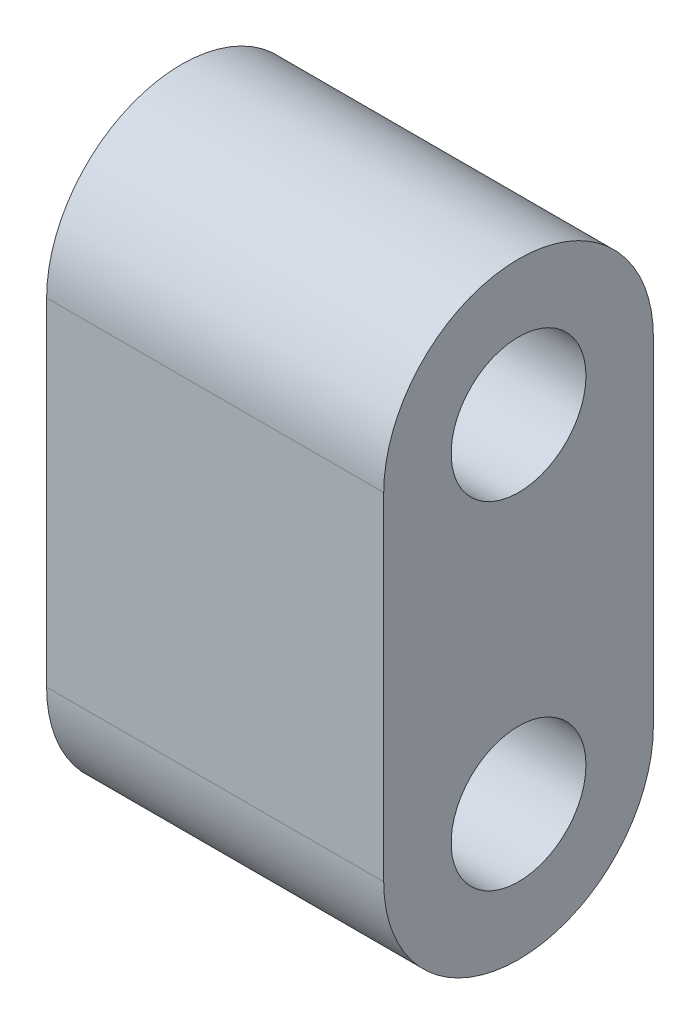
ISO-10303-21;
HEADER;
FILE_DESCRIPTION(('STEP AP214'),'2;1');
FILE_NAME('part.step','',(''),(''),'','','');
FILE_SCHEMA(('AUTOMOTIVE_DESIGN { 1 0 10303 214 1 1 1 1 }'));
ENDSEC;
DATA;
#1=APPLICATION_CONTEXT('core data for automotive mechanical design processes');
#2=APPLICATION_PROTOCOL_DEFINITION('international standard','automotive_design',2000,#1);
#3=PRODUCT_CONTEXT('',#1,'mechanical');
#4=PRODUCT('Part','Part','',(#3));
#5=PRODUCT_RELATED_PRODUCT_CATEGORY('part','',(#4));
#6=PRODUCT_DEFINITION_FORMATION('','',#4);
#7=PRODUCT_DEFINITION_CONTEXT('part definition',#1,'design');
#8=PRODUCT_DEFINITION('design','',#6,#7);
#9=PRODUCT_DEFINITION_SHAPE('','',#8);
#10=(LENGTH_UNIT() NAMED_UNIT(*) SI_UNIT(.MILLI.,.METRE.));
#11=(NAMED_UNIT(*) PLANE_ANGLE_UNIT() SI_UNIT($,.RADIAN.));
#12=(NAMED_UNIT(*) SI_UNIT($,.STERADIAN.) SOLID_ANGLE_UNIT());
#13=UNCERTAINTY_MEASURE_WITH_UNIT(LENGTH_MEASURE(1.E-05),#10,'distance_accuracy_value','');
#14=(GEOMETRIC_REPRESENTATION_CONTEXT(3) GLOBAL_UNCERTAINTY_ASSIGNED_CONTEXT((#13)) GLOBAL_UNIT_ASSIGNED_CONTEXT((#10,
#11,#12)) REPRESENTATION_CONTEXT('',''));
#15=CARTESIAN_POINT('',(0.,0.,0.));
#16=DIRECTION('',(0.,0.,1.));
#17=DIRECTION('',(1.,0.,0.));
#18=AXIS2_PLACEMENT_3D('',#15,#16,#17);
#19=CARTESIAN_POINT('',(5.,10.,0.));
#20=DIRECTION('',(1.,0.,0.));
#21=DIRECTION('',(0.,0.,-1.));
#22=AXIS2_PLACEMENT_3D('',#19,#20,#21);
#23=PLANE('',#22);
#24=CARTESIAN_POINT('',(5.,0.,0.));
#25=DIRECTION('',(1.,0.,0.));
#26=DIRECTION('',(0.,0.,-1.));
#27=AXIS2_PLACEMENT_3D('',#24,#25,#26);
#28=CIRCLE('',#27,2.);
#29=CARTESIAN_POINT('',(5.,0.,-2.));
#30=VERTEX_POINT('',#29);
#31=EDGE_CURVE('E99',#30,#30,#28,.T.);
#32=ORIENTED_EDGE('',*,*,#31,.F.);
#33=EDGE_LOOP('',(#32));
#34=FACE_BOUND('',#33,.T.);
#35=CARTESIAN_POINT('',(5.,10.,0.));
#36=DIRECTION('',(1.,0.,0.));
#37=DIRECTION('',(0.,0.,-1.));
#38=AXIS2_PLACEMENT_3D('',#35,#36,#37);
#39=CIRCLE('',#38,4.);
#40=CARTESIAN_POINT('',(5.,10.,-4.));
#41=VERTEX_POINT('',#40);
#42=CARTESIAN_POINT('',(5.,10.,4.));
#43=VERTEX_POINT('',#42);
#44=EDGE_CURVE('E84',#41,#43,#39,.T.);
#45=ORIENTED_EDGE('',*,*,#44,.T.);
#46=DIRECTION('',(0.,-1.,0.));
#47=VECTOR('',#46,1.);
#48=CARTESIAN_POINT('',(5.,10.,4.));
#49=LINE('',#48,#47);
#50=CARTESIAN_POINT('',(5.,0.,4.));
#51=VERTEX_POINT('',#50);
#52=EDGE_CURVE('E79',#43,#51,#49,.T.);
#53=ORIENTED_EDGE('',*,*,#52,.T.);
#54=CARTESIAN_POINT('',(5.,0.,0.));
#55=DIRECTION('',(1.,0.,0.));
#56=DIRECTION('',(0.,0.,1.));
#57=AXIS2_PLACEMENT_3D('',#54,#55,#56);
#58=CIRCLE('',#57,4.);
#59=CARTESIAN_POINT('',(5.,0.,-4.));
#60=VERTEX_POINT('',#59);
#61=EDGE_CURVE('E82',#51,#60,#58,.T.);
#62=ORIENTED_EDGE('',*,*,#61,.T.);
#63=DIRECTION('',(0.,1.,0.));
#64=VECTOR('',#63,1.);
#65=CARTESIAN_POINT('',(5.,10.,-4.));
#66=LINE('',#65,#64);
#67=EDGE_CURVE('E49',#60,#41,#66,.T.);
#68=ORIENTED_EDGE('',*,*,#67,.T.);
#69=EDGE_LOOP('',(#45,#53,#62,#68));
#70=FACE_BOUND('',#69,.T.);
#71=CARTESIAN_POINT('',(5.,10.,0.));
#72=DIRECTION('',(1.,0.,0.));
#73=DIRECTION('',(0.,0.,-1.));
#74=AXIS2_PLACEMENT_3D('',#71,#72,#73);
#75=CIRCLE('',#74,2.);
#76=CARTESIAN_POINT('',(5.,10.,-2.));
#77=VERTEX_POINT('',#76);
#78=EDGE_CURVE('E114',#77,#77,#75,.T.);
#79=ORIENTED_EDGE('',*,*,#78,.F.);
#80=EDGE_LOOP('',(#79));
#81=FACE_BOUND('',#80,.T.);
#82=ADVANCED_FACE('F32',(#34,#70,#81),#23,.T.);
#83=CARTESIAN_POINT('',(-5.,10.,0.));
#84=DIRECTION('',(1.,0.,0.));
#85=DIRECTION('',(0.,0.,-1.));
#86=AXIS2_PLACEMENT_3D('',#83,#84,#85);
#87=PLANE('',#86);
#88=CARTESIAN_POINT('',(-5.,0.,0.));
#89=DIRECTION('',(1.,0.,0.));
#90=DIRECTION('',(0.,0.,-1.));
#91=AXIS2_PLACEMENT_3D('',#88,#89,#90);
#92=CIRCLE('',#91,2.);
#93=CARTESIAN_POINT('',(-5.,0.,-2.));
#94=VERTEX_POINT('',#93);
#95=EDGE_CURVE('E111',#94,#94,#92,.T.);
#96=ORIENTED_EDGE('',*,*,#95,.T.);
#97=EDGE_LOOP('',(#96));
#98=FACE_BOUND('',#97,.T.);
#99=CARTESIAN_POINT('',(-5.,10.,0.));
#100=DIRECTION('',(1.,0.,0.));
#101=DIRECTION('',(0.,0.,-1.));
#102=AXIS2_PLACEMENT_3D('',#99,#100,#101);
#103=CIRCLE('',#102,4.);
#104=CARTESIAN_POINT('',(-5.,10.,-4.));
#105=VERTEX_POINT('',#104);
#106=CARTESIAN_POINT('',(-5.,10.,4.));
#107=VERTEX_POINT('',#106);
#108=EDGE_CURVE('E96',#105,#107,#103,.T.);
#109=ORIENTED_EDGE('',*,*,#108,.F.);
#110=DIRECTION('',(0.,1.,0.));
#111=VECTOR('',#110,1.);
#112=CARTESIAN_POINT('',(-5.,10.,-4.));
#113=LINE('',#112,#111);
#114=CARTESIAN_POINT('',(-5.,0.,-4.));
#115=VERTEX_POINT('',#114);
#116=EDGE_CURVE('E72',#115,#105,#113,.T.);
#117=ORIENTED_EDGE('',*,*,#116,.F.);
#118=CARTESIAN_POINT('',(-5.,0.,0.));
#119=DIRECTION('',(1.,0.,0.));
#120=DIRECTION('',(0.,0.,1.));
#121=AXIS2_PLACEMENT_3D('',#118,#119,#120);
#122=CIRCLE('',#121,4.);
#123=CARTESIAN_POINT('',(-5.,0.,4.));
#124=VERTEX_POINT('',#123);
#125=EDGE_CURVE('E66',#124,#115,#122,.T.);
#126=ORIENTED_EDGE('',*,*,#125,.F.);
#127=DIRECTION('',(0.,-1.,0.));
#128=VECTOR('',#127,1.);
#129=CARTESIAN_POINT('',(-5.,10.,4.));
#130=LINE('',#129,#128);
#131=EDGE_CURVE('E88',#107,#124,#130,.T.);
#132=ORIENTED_EDGE('',*,*,#131,.F.);
#133=EDGE_LOOP('',(#109,#117,#126,#132));
#134=FACE_BOUND('',#133,.T.);
#135=CARTESIAN_POINT('',(-5.,10.,0.));
#136=DIRECTION('',(1.,0.,0.));
#137=DIRECTION('',(0.,0.,-1.));
#138=AXIS2_PLACEMENT_3D('',#135,#136,#137);
#139=CIRCLE('',#138,2.);
#140=CARTESIAN_POINT('',(-5.,10.,-2.));
#141=VERTEX_POINT('',#140);
#142=EDGE_CURVE('E117',#141,#141,#139,.T.);
#143=ORIENTED_EDGE('',*,*,#142,.T.);
#144=EDGE_LOOP('',(#143));
#145=FACE_BOUND('',#144,.T.);
#146=ADVANCED_FACE('F107',(#98,#134,#145),#87,.F.);
#147=CARTESIAN_POINT('',(5.,10.,0.));
#148=DIRECTION('',(-1.,0.,0.));
#149=DIRECTION('',(0.,0.,1.));
#150=AXIS2_PLACEMENT_3D('',#147,#148,#149);
#151=CYLINDRICAL_SURFACE('',#150,4.);
#152=ORIENTED_EDGE('',*,*,#108,.T.);
#153=DIRECTION('',(-1.,0.,0.));
#154=VECTOR('',#153,1.);
#155=CARTESIAN_POINT('',(5.,10.,4.));
#156=LINE('',#155,#154);
#157=EDGE_CURVE('E11',#43,#107,#156,.T.);
#158=ORIENTED_EDGE('',*,*,#157,.F.);
#159=ORIENTED_EDGE('',*,*,#44,.F.);
#160=DIRECTION('',(-1.,0.,0.));
#161=VECTOR('',#160,1.);
#162=CARTESIAN_POINT('',(5.,10.,-4.));
#163=LINE('',#162,#161);
#164=EDGE_CURVE('E92',#41,#105,#163,.T.);
#165=ORIENTED_EDGE('',*,*,#164,.T.);
#166=EDGE_LOOP('',(#152,#158,#159,#165));
#167=FACE_BOUND('',#166,.T.);
#168=ADVANCED_FACE('F34',(#167),#151,.T.);
#169=CARTESIAN_POINT('',(5.,10.,4.));
#170=DIRECTION('',(0.,0.,-1.));
#171=DIRECTION('',(0.,1.,0.));
#172=AXIS2_PLACEMENT_3D('',#169,#170,#171);
#173=PLANE('',#172);
#174=ORIENTED_EDGE('',*,*,#131,.T.);
#175=DIRECTION('',(-1.,0.,0.));
#176=VECTOR('',#175,1.);
#177=CARTESIAN_POINT('',(5.,0.,4.));
#178=LINE('',#177,#176);
#179=EDGE_CURVE('E41',#51,#124,#178,.T.);
#180=ORIENTED_EDGE('',*,*,#179,.F.);
#181=ORIENTED_EDGE('',*,*,#52,.F.);
#182=ORIENTED_EDGE('',*,*,#157,.T.);
#183=EDGE_LOOP('',(#174,#180,#181,#182));
#184=FACE_BOUND('',#183,.T.);
#185=ADVANCED_FACE('F87',(#184),#173,.F.);
#186=CARTESIAN_POINT('',(5.,0.,0.));
#187=DIRECTION('',(-1.,0.,0.));
#188=DIRECTION('',(0.,0.,1.));
#189=AXIS2_PLACEMENT_3D('',#186,#187,#188);
#190=CYLINDRICAL_SURFACE('',#189,4.);
#191=ORIENTED_EDGE('',*,*,#125,.T.);
#192=DIRECTION('',(-1.,0.,0.));
#193=VECTOR('',#192,1.);
#194=CARTESIAN_POINT('',(5.,0.,-4.));
#195=LINE('',#194,#193);
#196=EDGE_CURVE('E89',#60,#115,#195,.T.);
#197=ORIENTED_EDGE('',*,*,#196,.F.);
#198=ORIENTED_EDGE('',*,*,#61,.F.);
#199=ORIENTED_EDGE('',*,*,#179,.T.);
#200=EDGE_LOOP('',(#191,#197,#198,#199));
#201=FACE_BOUND('',#200,.T.);
#202=ADVANCED_FACE('F90',(#201),#190,.T.);
#203=CARTESIAN_POINT('',(5.,10.,-4.));
#204=DIRECTION('',(0.,0.,1.));
#205=DIRECTION('',(0.,-1.,0.));
#206=AXIS2_PLACEMENT_3D('',#203,#204,#205);
#207=PLANE('',#206);
#208=ORIENTED_EDGE('',*,*,#116,.T.);
#209=ORIENTED_EDGE('',*,*,#164,.F.);
#210=ORIENTED_EDGE('',*,*,#67,.F.);
#211=ORIENTED_EDGE('',*,*,#196,.T.);
#212=EDGE_LOOP('',(#208,#209,#210,#211));
#213=FACE_BOUND('',#212,.T.);
#214=ADVANCED_FACE('F104',(#213),#207,.F.);
#215=CARTESIAN_POINT('',(5.,0.,0.));
#216=DIRECTION('',(-1.,0.,0.));
#217=DIRECTION('',(0.,0.,1.));
#218=AXIS2_PLACEMENT_3D('',#215,#216,#217);
#219=CYLINDRICAL_SURFACE('',#218,2.);
#220=ORIENTED_EDGE('',*,*,#31,.T.);
#221=EDGE_LOOP('',(#220));
#222=FACE_BOUND('',#221,.T.);
#223=ORIENTED_EDGE('',*,*,#95,.F.);
#224=EDGE_LOOP('',(#223));
#225=FACE_BOUND('',#224,.T.);
#226=ADVANCED_FACE('F135',(#222,#225),#219,.F.);
#227=CARTESIAN_POINT('',(5.,10.,0.));
#228=DIRECTION('',(-1.,0.,0.));
#229=DIRECTION('',(0.,0.,1.));
#230=AXIS2_PLACEMENT_3D('',#227,#228,#229);
#231=CYLINDRICAL_SURFACE('',#230,2.);
#232=ORIENTED_EDGE('',*,*,#78,.T.);
#233=EDGE_LOOP('',(#232));
#234=FACE_BOUND('',#233,.T.);
#235=ORIENTED_EDGE('',*,*,#142,.F.);
#236=EDGE_LOOP('',(#235));
#237=FACE_BOUND('',#236,.T.);
#238=ADVANCED_FACE('F123',(#234,#237),#231,.F.);
#239=CLOSED_SHELL('',(#82,#146,#168,#185,#202,#214,#226,#238));
#240=MANIFOLD_SOLID_BREP('B2',#239);
#241=ADVANCED_BREP_SHAPE_REPRESENTATION('',(#18,#240),#14);
#242=SHAPE_DEFINITION_REPRESENTATION(#9,#241);
ENDSEC;
END-ISO-10303-21;
